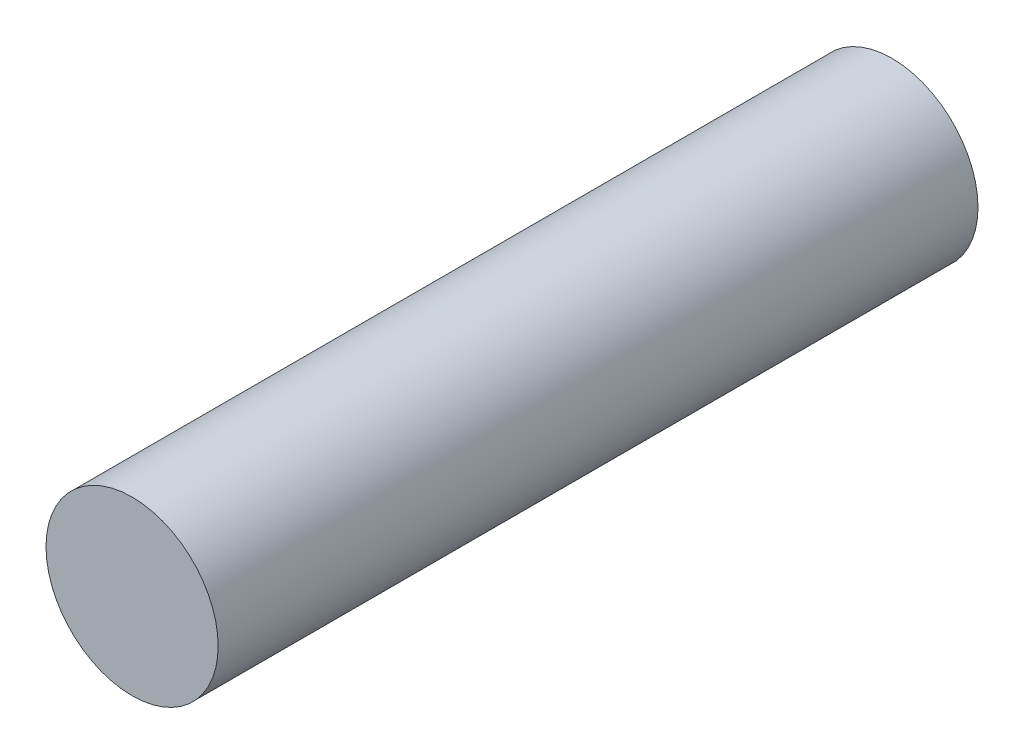
ISO-10303-21;
HEADER;
FILE_DESCRIPTION(('STEP AP214'),'2;1');
FILE_NAME('part.step','',(''),(''),'','','');
FILE_SCHEMA(('AUTOMOTIVE_DESIGN { 1 0 10303 214 1 1 1 1 }'));
ENDSEC;
DATA;
#1=APPLICATION_CONTEXT('core data for automotive mechanical design processes');
#2=APPLICATION_PROTOCOL_DEFINITION('international standard','automotive_design',2000,#1);
#3=PRODUCT_CONTEXT('',#1,'mechanical');
#4=PRODUCT('Part','Part','',(#3));
#5=PRODUCT_RELATED_PRODUCT_CATEGORY('part','',(#4));
#6=PRODUCT_DEFINITION_FORMATION('','',#4);
#7=PRODUCT_DEFINITION_CONTEXT('part definition',#1,'design');
#8=PRODUCT_DEFINITION('design','',#6,#7);
#9=PRODUCT_DEFINITION_SHAPE('','',#8);
#10=(LENGTH_UNIT() NAMED_UNIT(*) SI_UNIT(.MILLI.,.METRE.));
#11=(NAMED_UNIT(*) PLANE_ANGLE_UNIT() SI_UNIT($,.RADIAN.));
#12=(NAMED_UNIT(*) SI_UNIT($,.STERADIAN.) SOLID_ANGLE_UNIT());
#13=UNCERTAINTY_MEASURE_WITH_UNIT(LENGTH_MEASURE(1.E-05),#10,'distance_accuracy_value','');
#14=(GEOMETRIC_REPRESENTATION_CONTEXT(3) GLOBAL_UNCERTAINTY_ASSIGNED_CONTEXT((#13)) GLOBAL_UNIT_ASSIGNED_CONTEXT((#10,
#11,#12)) REPRESENTATION_CONTEXT('',''));
#15=CARTESIAN_POINT('',(0.,0.,0.));
#16=DIRECTION('',(0.,0.,1.));
#17=DIRECTION('',(1.,0.,0.));
#18=AXIS2_PLACEMENT_3D('',#15,#16,#17);
#19=CARTESIAN_POINT('',(0.,0.,9.53008));
#20=DIRECTION('',(0.,0.,-1.));
#21=DIRECTION('',(-1.,0.,0.));
#22=AXIS2_PLACEMENT_3D('',#19,#20,#21);
#23=CYLINDRICAL_SURFACE('',#22,1.0795);
#24=CARTESIAN_POINT('',(0.,0.,9.53008));
#25=DIRECTION('',(0.,0.,1.));
#26=DIRECTION('',(1.,0.,0.));
#27=AXIS2_PLACEMENT_3D('',#24,#25,#26);
#28=CIRCLE('',#27,1.0795);
#29=CARTESIAN_POINT('',(1.0795,0.,9.53008));
#30=VERTEX_POINT('',#29);
#31=EDGE_CURVE('E10',#30,#30,#28,.T.);
#32=ORIENTED_EDGE('',*,*,#31,.F.);
#33=EDGE_LOOP('',(#32));
#34=FACE_BOUND('',#33,.T.);
#35=CARTESIAN_POINT('',(0.,0.,0.));
#36=DIRECTION('',(0.,0.,1.));
#37=DIRECTION('',(1.,0.,0.));
#38=AXIS2_PLACEMENT_3D('',#35,#36,#37);
#39=CIRCLE('',#38,1.0795);
#40=CARTESIAN_POINT('',(1.0795,0.,0.));
#41=VERTEX_POINT('',#40);
#42=EDGE_CURVE('E33',#41,#41,#39,.T.);
#43=ORIENTED_EDGE('',*,*,#42,.T.);
#44=EDGE_LOOP('',(#43));
#45=FACE_BOUND('',#44,.T.);
#46=ADVANCED_FACE('F30',(#34,#45),#23,.T.);
#47=CARTESIAN_POINT('',(0.,0.,9.53008));
#48=DIRECTION('',(0.,0.,1.));
#49=DIRECTION('',(1.,0.,0.));
#50=AXIS2_PLACEMENT_3D('',#47,#48,#49);
#51=PLANE('',#50);
#52=ORIENTED_EDGE('',*,*,#31,.T.);
#53=EDGE_LOOP('',(#52));
#54=FACE_BOUND('',#53,.T.);
#55=ADVANCED_FACE('F45',(#54),#51,.T.);
#56=CARTESIAN_POINT('',(0.,0.,0.));
#57=DIRECTION('',(0.,0.,1.));
#58=DIRECTION('',(1.,0.,0.));
#59=AXIS2_PLACEMENT_3D('',#56,#57,#58);
#60=PLANE('',#59);
#61=ORIENTED_EDGE('',*,*,#42,.F.);
#62=EDGE_LOOP('',(#61));
#63=FACE_BOUND('',#62,.T.);
#64=ADVANCED_FACE('F43',(#63),#60,.F.);
#65=CLOSED_SHELL('',(#46,#55,#64));
#66=MANIFOLD_SOLID_BREP('B2',#65);
#67=ADVANCED_BREP_SHAPE_REPRESENTATION('',(#18,#66),#14);
#68=SHAPE_DEFINITION_REPRESENTATION(#9,#67);
ENDSEC;
END-ISO-10303-21;
